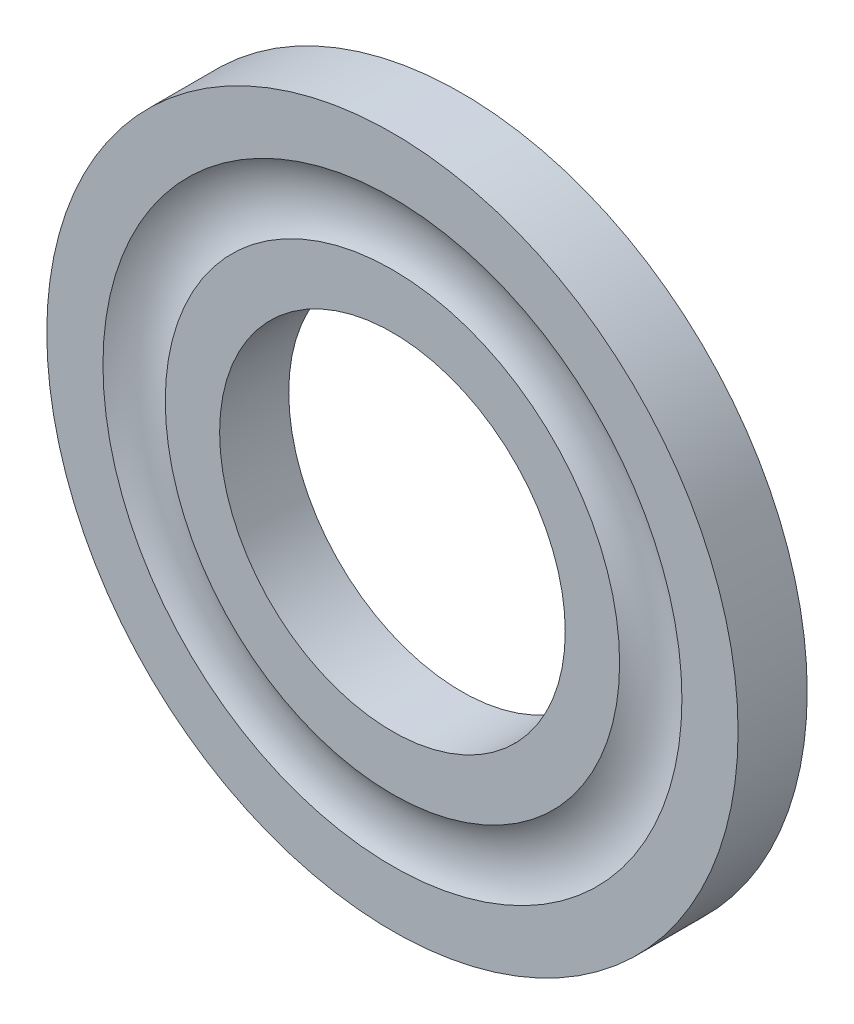
ISO-10303-21;
HEADER;
FILE_DESCRIPTION(('STEP AP214'),'2;1');
FILE_NAME('part.step','',(''),(''),'','','');
FILE_SCHEMA(('AUTOMOTIVE_DESIGN { 1 0 10303 214 1 1 1 1 }'));
ENDSEC;
DATA;
#1=APPLICATION_CONTEXT('core data for automotive mechanical design processes');
#2=APPLICATION_PROTOCOL_DEFINITION('international standard','automotive_design',2000,#1);
#3=PRODUCT_CONTEXT('',#1,'mechanical');
#4=PRODUCT('Part','Part','',(#3));
#5=PRODUCT_RELATED_PRODUCT_CATEGORY('part','',(#4));
#6=PRODUCT_DEFINITION_FORMATION('','',#4);
#7=PRODUCT_DEFINITION_CONTEXT('part definition',#1,'design');
#8=PRODUCT_DEFINITION('design','',#6,#7);
#9=PRODUCT_DEFINITION_SHAPE('','',#8);
#10=(LENGTH_UNIT() NAMED_UNIT(*) SI_UNIT(.MILLI.,.METRE.));
#11=(NAMED_UNIT(*) PLANE_ANGLE_UNIT() SI_UNIT($,.RADIAN.));
#12=(NAMED_UNIT(*) SI_UNIT($,.STERADIAN.) SOLID_ANGLE_UNIT());
#13=UNCERTAINTY_MEASURE_WITH_UNIT(LENGTH_MEASURE(1.E-05),#10,'distance_accuracy_value','');
#14=(GEOMETRIC_REPRESENTATION_CONTEXT(3) GLOBAL_UNCERTAINTY_ASSIGNED_CONTEXT((#13)) GLOBAL_UNIT_ASSIGNED_CONTEXT((#10,
#11,#12)) REPRESENTATION_CONTEXT('',''));
#15=CARTESIAN_POINT('',(0.,0.,0.));
#16=DIRECTION('',(0.,0.,1.));
#17=DIRECTION('',(1.,0.,0.));
#18=AXIS2_PLACEMENT_3D('',#15,#16,#17);
#19=CARTESIAN_POINT('',(0.,0.,4.));
#20=DIRECTION('',(0.,0.,1.));
#21=DIRECTION('',(1.,0.,0.));
#22=AXIS2_PLACEMENT_3D('',#19,#20,#21);
#23=PLANE('',#22);
#24=CARTESIAN_POINT('',(0.,0.,4.));
#25=DIRECTION('',(0.,0.,1.));
#26=DIRECTION('',(1.,0.,0.));
#27=AXIS2_PLACEMENT_3D('',#24,#25,#26);
#28=CIRCLE('',#27,20.);
#29=CARTESIAN_POINT('',(20.,0.,4.));
#30=VERTEX_POINT('',#29);
#31=EDGE_CURVE('E10',#30,#30,#28,.T.);
#32=ORIENTED_EDGE('',*,*,#31,.T.);
#33=EDGE_LOOP('',(#32));
#34=FACE_BOUND('',#33,.T.);
#35=CARTESIAN_POINT('',(0.,0.,4.));
#36=DIRECTION('',(0.,0.,1.));
#37=DIRECTION('',(1.,0.,0.));
#38=AXIS2_PLACEMENT_3D('',#35,#36,#37);
#39=CIRCLE('',#38,16.7505627356818);
#40=CARTESIAN_POINT('',(16.7505627356818,0.,4.));
#41=VERTEX_POINT('',#40);
#42=EDGE_CURVE('E33',#41,#41,#39,.F.);
#43=ORIENTED_EDGE('',*,*,#42,.T.);
#44=EDGE_LOOP('',(#43));
#45=FACE_BOUND('',#44,.T.);
#46=ADVANCED_FACE('F29',(#34,#45),#23,.T.);
#47=CARTESIAN_POINT('',(0.,0.,4.));
#48=DIRECTION('',(0.,0.,1.));
#49=DIRECTION('',(1.,0.,0.));
#50=AXIS2_PLACEMENT_3D('',#47,#48,#49);
#51=CIRCLE('',#50,10.);
#52=CARTESIAN_POINT('',(10.,0.,4.));
#53=VERTEX_POINT('',#52);
#54=EDGE_CURVE('E42',#53,#53,#51,.T.);
#55=ORIENTED_EDGE('',*,*,#54,.F.);
#56=EDGE_LOOP('',(#55));
#57=FACE_BOUND('',#56,.T.);
#58=CARTESIAN_POINT('',(0.,0.,4.));
#59=DIRECTION('',(0.,0.,-1.));
#60=DIRECTION('',(-1.,0.,0.));
#61=AXIS2_PLACEMENT_3D('',#58,#59,#60);
#62=CIRCLE('',#61,13.1450114602178);
#63=CARTESIAN_POINT('',(-13.1450114602178,0.,4.));
#64=VERTEX_POINT('',#63);
#65=EDGE_CURVE('E47',#64,#64,#62,.F.);
#66=ORIENTED_EDGE('',*,*,#65,.T.);
#67=EDGE_LOOP('',(#66));
#68=FACE_BOUND('',#67,.T.);
#69=ADVANCED_FACE('F63',(#57,#68),#23,.T.);
#70=CARTESIAN_POINT('',(0.,0.,0.));
#71=DIRECTION('',(0.,0.,1.));
#72=DIRECTION('',(1.,0.,0.));
#73=AXIS2_PLACEMENT_3D('',#70,#71,#72);
#74=PLANE('',#73);
#75=CARTESIAN_POINT('',(0.,0.,0.));
#76=DIRECTION('',(0.,0.,1.));
#77=DIRECTION('',(1.,0.,0.));
#78=AXIS2_PLACEMENT_3D('',#75,#76,#77);
#79=CIRCLE('',#78,20.);
#80=CARTESIAN_POINT('',(20.,0.,0.));
#81=VERTEX_POINT('',#80);
#82=EDGE_CURVE('E37',#81,#81,#79,.T.);
#83=ORIENTED_EDGE('',*,*,#82,.F.);
#84=EDGE_LOOP('',(#83));
#85=FACE_BOUND('',#84,.T.);
#86=CARTESIAN_POINT('',(0.,0.,0.));
#87=DIRECTION('',(0.,0.,1.));
#88=DIRECTION('',(1.,0.,0.));
#89=AXIS2_PLACEMENT_3D('',#86,#87,#88);
#90=CIRCLE('',#89,10.);
#91=CARTESIAN_POINT('',(10.,0.,0.));
#92=VERTEX_POINT('',#91);
#93=EDGE_CURVE('E45',#92,#92,#90,.T.);
#94=ORIENTED_EDGE('',*,*,#93,.T.);
#95=EDGE_LOOP('',(#94));
#96=FACE_BOUND('',#95,.T.);
#97=ADVANCED_FACE('F65',(#85,#96),#74,.F.);
#98=CARTESIAN_POINT('',(0.,0.,4.));
#99=DIRECTION('',(0.,0.,-1.));
#100=DIRECTION('',(-1.,0.,0.));
#101=AXIS2_PLACEMENT_3D('',#98,#99,#100);
#102=CYLINDRICAL_SURFACE('',#101,20.);
#103=ORIENTED_EDGE('',*,*,#31,.F.);
#104=EDGE_LOOP('',(#103));
#105=FACE_BOUND('',#104,.T.);
#106=ORIENTED_EDGE('',*,*,#82,.T.);
#107=EDGE_LOOP('',(#106));
#108=FACE_BOUND('',#107,.T.);
#109=ADVANCED_FACE('F31',(#105,#108),#102,.T.);
#110=CARTESIAN_POINT('',(0.,0.,4.));
#111=DIRECTION('',(0.,0.,-1.));
#112=DIRECTION('',(-1.,0.,0.));
#113=AXIS2_PLACEMENT_3D('',#110,#111,#112);
#114=CYLINDRICAL_SURFACE('',#113,10.);
#115=ORIENTED_EDGE('',*,*,#54,.T.);
#116=EDGE_LOOP('',(#115));
#117=FACE_BOUND('',#116,.T.);
#118=ORIENTED_EDGE('',*,*,#93,.F.);
#119=EDGE_LOOP('',(#118));
#120=FACE_BOUND('',#119,.T.);
#121=ADVANCED_FACE('F60',(#117,#120),#114,.F.);
#122=CARTESIAN_POINT('',(0.,0.,7.));
#123=DIRECTION('',(0.,0.,-1.));
#124=DIRECTION('',(-1.,0.,0.));
#125=AXIS2_PLACEMENT_3D('',#122,#123,#124);
#126=TOROIDAL_SURFACE('',#125,14.9477870979498,3.5);
#127=ORIENTED_EDGE('',*,*,#42,.F.);
#128=EDGE_LOOP('',(#127));
#129=FACE_BOUND('',#128,.T.);
#130=ORIENTED_EDGE('',*,*,#65,.F.);
#131=EDGE_LOOP('',(#130));
#132=FACE_BOUND('',#131,.T.);
#133=ADVANCED_FACE('F75',(#129,#132),#126,.F.);
#134=CLOSED_SHELL('',(#46,#69,#97,#109,#121,#133));
#135=MANIFOLD_SOLID_BREP('B2',#134);
#136=ADVANCED_BREP_SHAPE_REPRESENTATION('',(#18,#135),#14);
#137=SHAPE_DEFINITION_REPRESENTATION(#9,#136);
ENDSEC;
END-ISO-10303-21;
